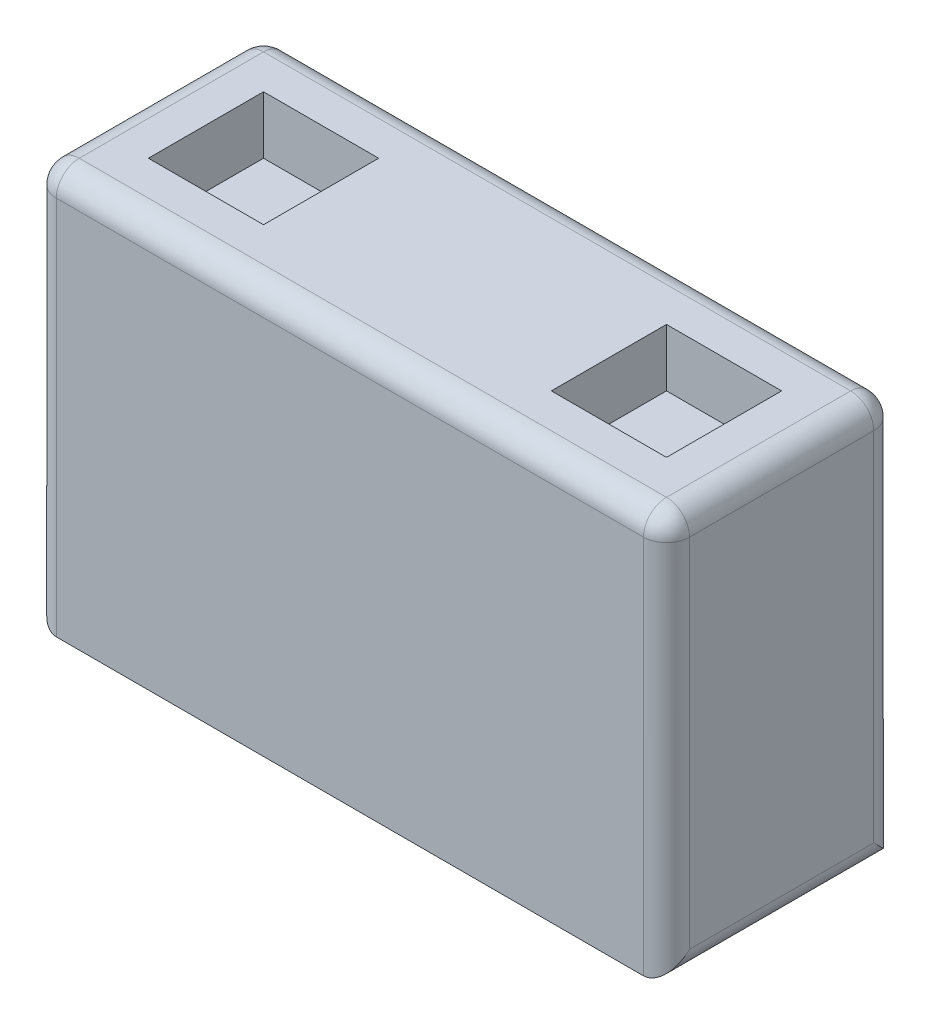
ISO-10303-21;
HEADER;
FILE_DESCRIPTION(('STEP AP214'),'2;1');
FILE_NAME('part.step','',(''),(''),'','','');
FILE_SCHEMA(('AUTOMOTIVE_DESIGN { 1 0 10303 214 1 1 1 1 }'));
ENDSEC;
DATA;
#1=APPLICATION_CONTEXT('core data for automotive mechanical design processes');
#2=APPLICATION_PROTOCOL_DEFINITION('international standard','automotive_design',2000,#1);
#3=PRODUCT_CONTEXT('',#1,'mechanical');
#4=PRODUCT('Part','Part','',(#3));
#5=PRODUCT_RELATED_PRODUCT_CATEGORY('part','',(#4));
#6=PRODUCT_DEFINITION_FORMATION('','',#4);
#7=PRODUCT_DEFINITION_CONTEXT('part definition',#1,'design');
#8=PRODUCT_DEFINITION('design','',#6,#7);
#9=PRODUCT_DEFINITION_SHAPE('','',#8);
#10=(LENGTH_UNIT() NAMED_UNIT(*) SI_UNIT(.MILLI.,.METRE.));
#11=(NAMED_UNIT(*) PLANE_ANGLE_UNIT() SI_UNIT($,.RADIAN.));
#12=(NAMED_UNIT(*) SI_UNIT($,.STERADIAN.) SOLID_ANGLE_UNIT());
#13=UNCERTAINTY_MEASURE_WITH_UNIT(LENGTH_MEASURE(1.E-05),#10,'distance_accuracy_value','');
#14=(GEOMETRIC_REPRESENTATION_CONTEXT(3) GLOBAL_UNCERTAINTY_ASSIGNED_CONTEXT((#13)) GLOBAL_UNIT_ASSIGNED_CONTEXT((#10,
#11,#12)) REPRESENTATION_CONTEXT('',''));
#15=CARTESIAN_POINT('',(0.,0.,0.));
#16=DIRECTION('',(0.,0.,1.));
#17=DIRECTION('',(1.,0.,0.));
#18=AXIS2_PLACEMENT_3D('',#15,#16,#17);
#19=CARTESIAN_POINT('',(0.,0.,20.));
#20=DIRECTION('',(0.,0.,-1.));
#21=DIRECTION('',(-1.,0.,0.));
#22=AXIS2_PLACEMENT_3D('',#19,#20,#21);
#23=PLANE('',#22);
#24=DIRECTION('',(0.,-1.,0.));
#25=VECTOR('',#24,1.);
#26=CARTESIAN_POINT('',(-25.5,0.,20.));
#27=LINE('',#26,#25);
#28=CARTESIAN_POINT('',(-25.5,30.5,20.));
#29=VERTEX_POINT('',#28);
#30=CARTESIAN_POINT('',(-25.5,-2.50000000000001,20.));
#31=VERTEX_POINT('',#30);
#32=EDGE_CURVE('E331',#29,#31,#27,.T.);
#33=ORIENTED_EDGE('',*,*,#32,.T.);
#34=DIRECTION('',(1.,0.,0.));
#35=VECTOR('',#34,1.);
#36=CARTESIAN_POINT('',(21.5,-2.5,20.));
#37=LINE('',#36,#35);
#38=CARTESIAN_POINT('',(25.5,-2.5,20.));
#39=VERTEX_POINT('',#38);
#40=EDGE_CURVE('E288',#31,#39,#37,.T.);
#41=ORIENTED_EDGE('',*,*,#40,.T.);
#42=DIRECTION('',(0.,1.,0.));
#43=VECTOR('',#42,1.);
#44=CARTESIAN_POINT('',(25.5,0.,20.));
#45=LINE('',#44,#43);
#46=CARTESIAN_POINT('',(25.5,30.5,20.));
#47=VERTEX_POINT('',#46);
#48=EDGE_CURVE('E11',#39,#47,#45,.T.);
#49=ORIENTED_EDGE('',*,*,#48,.T.);
#50=DIRECTION('',(-1.,0.,0.));
#51=VECTOR('',#50,1.);
#52=CARTESIAN_POINT('',(0.,30.5,20.));
#53=LINE('',#52,#51);
#54=EDGE_CURVE('E44',#47,#29,#53,.T.);
#55=ORIENTED_EDGE('',*,*,#54,.T.);
#56=EDGE_LOOP('',(#33,#41,#49,#55));
#57=FACE_BOUND('',#56,.T.);
#58=ADVANCED_FACE('F35',(#57),#23,.F.);
#59=CARTESIAN_POINT('',(0.,0.,0.));
#60=DIRECTION('',(0.,0.,-1.));
#61=DIRECTION('',(-1.,0.,0.));
#62=AXIS2_PLACEMENT_3D('',#59,#60,#61);
#63=PLANE('',#62);
#64=DIRECTION('',(1.,0.,0.));
#65=VECTOR('',#64,1.);
#66=CARTESIAN_POINT('',(21.5,-2.5,0.));
#67=LINE('',#66,#65);
#68=CARTESIAN_POINT('',(-25.5,-2.50000000000001,0.));
#69=VERTEX_POINT('',#68);
#70=CARTESIAN_POINT('',(25.5,-2.5,0.));
#71=VERTEX_POINT('',#70);
#72=EDGE_CURVE('E250',#69,#71,#67,.T.);
#73=ORIENTED_EDGE('',*,*,#72,.F.);
#74=DIRECTION('',(0.,-1.,0.));
#75=VECTOR('',#74,1.);
#76=CARTESIAN_POINT('',(-25.5,32.5,0.));
#77=LINE('',#76,#75);
#78=CARTESIAN_POINT('',(-25.5,30.5,0.));
#79=VERTEX_POINT('',#78);
#80=EDGE_CURVE('E315',#69,#79,#77,.F.);
#81=ORIENTED_EDGE('',*,*,#80,.T.);
#82=DIRECTION('',(-1.,0.,0.));
#83=VECTOR('',#82,1.);
#84=CARTESIAN_POINT('',(27.5,30.5,0.));
#85=LINE('',#84,#83);
#86=CARTESIAN_POINT('',(25.5,30.5,0.));
#87=VERTEX_POINT('',#86);
#88=EDGE_CURVE('E317',#79,#87,#85,.F.);
#89=ORIENTED_EDGE('',*,*,#88,.T.);
#90=DIRECTION('',(0.,1.,0.));
#91=VECTOR('',#90,1.);
#92=CARTESIAN_POINT('',(25.5,-2.5,0.));
#93=LINE('',#92,#91);
#94=EDGE_CURVE('E319',#87,#71,#93,.F.);
#95=ORIENTED_EDGE('',*,*,#94,.T.);
#96=EDGE_LOOP('',(#73,#81,#89,#95));
#97=FACE_BOUND('',#96,.T.);
#98=ADVANCED_FACE('F432',(#97),#63,.T.);
#99=CARTESIAN_POINT('',(-27.5,-2.50000000000001,20.));
#100=DIRECTION('',(1.,0.,0.));
#101=DIRECTION('',(0.,0.,-1.));
#102=AXIS2_PLACEMENT_3D('',#99,#100,#101);
#103=PLANE('',#102);
#104=DIRECTION('',(0.,0.,-1.));
#105=VECTOR('',#104,1.);
#106=CARTESIAN_POINT('',(-27.5,30.5,20.));
#107=LINE('',#106,#105);
#108=CARTESIAN_POINT('',(-27.5,30.5,18.));
#109=VERTEX_POINT('',#108);
#110=CARTESIAN_POINT('',(-27.5,30.5,2.));
#111=VERTEX_POINT('',#110);
#112=EDGE_CURVE('E296',#109,#111,#107,.T.);
#113=ORIENTED_EDGE('',*,*,#112,.T.);
#114=DIRECTION('',(0.,-1.,0.));
#115=VECTOR('',#114,1.);
#116=CARTESIAN_POINT('',(-27.5,-2.50000000000001,2.));
#117=LINE('',#116,#115);
#118=CARTESIAN_POINT('',(-27.5,-0.500000000000009,2.));
#119=VERTEX_POINT('',#118);
#120=EDGE_CURVE('E301',#111,#119,#117,.T.);
#121=ORIENTED_EDGE('',*,*,#120,.T.);
#122=DIRECTION('',(0.,0.,-1.));
#123=VECTOR('',#122,1.);
#124=CARTESIAN_POINT('',(-27.5,-0.500000000000009,20.));
#125=LINE('',#124,#123);
#126=CARTESIAN_POINT('',(-27.5,-0.500000000000009,18.));
#127=VERTEX_POINT('',#126);
#128=EDGE_CURVE('E298',#119,#127,#125,.F.);
#129=ORIENTED_EDGE('',*,*,#128,.T.);
#130=DIRECTION('',(0.,-1.,0.));
#131=VECTOR('',#130,1.);
#132=CARTESIAN_POINT('',(-27.5,-2.50000000000001,18.));
#133=LINE('',#132,#131);
#134=EDGE_CURVE('E294',#127,#109,#133,.F.);
#135=ORIENTED_EDGE('',*,*,#134,.T.);
#136=EDGE_LOOP('',(#113,#121,#129,#135));
#137=FACE_BOUND('',#136,.T.);
#138=ADVANCED_FACE('F441',(#137),#103,.F.);
#139=CARTESIAN_POINT('',(21.5,-2.5,20.));
#140=DIRECTION('',(0.,1.,0.));
#141=DIRECTION('',(0.,0.,1.));
#142=AXIS2_PLACEMENT_3D('',#139,#140,#141);
#143=PLANE('',#142);
#144=DIRECTION('',(-1.,0.,0.));
#145=VECTOR('',#144,1.);
#146=CARTESIAN_POINT('',(-21.5,-2.5,17.5));
#147=LINE('',#146,#145);
#148=CARTESIAN_POINT('',(21.5,-2.5,17.5));
#149=VERTEX_POINT('',#148);
#150=CARTESIAN_POINT('',(-21.5,-2.5,17.5));
#151=VERTEX_POINT('',#150);
#152=EDGE_CURVE('E213',#149,#151,#147,.T.);
#153=ORIENTED_EDGE('',*,*,#152,.F.);
#154=DIRECTION('',(0.,0.,1.));
#155=VECTOR('',#154,1.);
#156=CARTESIAN_POINT('',(21.5,-2.5,17.5));
#157=LINE('',#156,#155);
#158=CARTESIAN_POINT('',(21.5,-2.5,2.5));
#159=VERTEX_POINT('',#158);
#160=EDGE_CURVE('E52',#159,#149,#157,.T.);
#161=ORIENTED_EDGE('',*,*,#160,.F.);
#162=DIRECTION('',(1.,0.,0.));
#163=VECTOR('',#162,1.);
#164=CARTESIAN_POINT('',(-21.5,-2.5,2.5));
#165=LINE('',#164,#163);
#166=CARTESIAN_POINT('',(-21.5,-2.5,2.5));
#167=VERTEX_POINT('',#166);
#168=EDGE_CURVE('E204',#167,#159,#165,.T.);
#169=ORIENTED_EDGE('',*,*,#168,.F.);
#170=DIRECTION('',(0.,0.,-1.));
#171=VECTOR('',#170,1.);
#172=CARTESIAN_POINT('',(-21.5,-2.5,17.5));
#173=LINE('',#172,#171);
#174=EDGE_CURVE('E207',#151,#167,#173,.T.);
#175=ORIENTED_EDGE('',*,*,#174,.F.);
#176=EDGE_LOOP('',(#153,#161,#169,#175));
#177=FACE_BOUND('',#176,.T.);
#178=DIRECTION('',(0.,0.,-1.));
#179=VECTOR('',#178,1.);
#180=CARTESIAN_POINT('',(-25.5,-2.50000000000001,20.));
#181=LINE('',#180,#179);
#182=EDGE_CURVE('E290',#31,#69,#181,.T.);
#183=ORIENTED_EDGE('',*,*,#182,.T.);
#184=ORIENTED_EDGE('',*,*,#72,.T.);
#185=DIRECTION('',(0.,0.,-1.));
#186=VECTOR('',#185,1.);
#187=CARTESIAN_POINT('',(25.5,-2.5,20.));
#188=LINE('',#187,#186);
#189=EDGE_CURVE('E312',#71,#39,#188,.F.);
#190=ORIENTED_EDGE('',*,*,#189,.T.);
#191=ORIENTED_EDGE('',*,*,#40,.F.);
#192=EDGE_LOOP('',(#183,#184,#190,#191));
#193=FACE_BOUND('',#192,.T.);
#194=ADVANCED_FACE('F430',(#177,#193),#143,.F.);
#195=CARTESIAN_POINT('',(27.5,32.5,20.));
#196=DIRECTION('',(-1.,0.,0.));
#197=DIRECTION('',(0.,-1.,0.));
#198=AXIS2_PLACEMENT_3D('',#195,#196,#197);
#199=PLANE('',#198);
#200=DIRECTION('',(0.,1.,0.));
#201=VECTOR('',#200,1.);
#202=CARTESIAN_POINT('',(27.5,32.5,18.));
#203=LINE('',#202,#201);
#204=CARTESIAN_POINT('',(27.5,30.5,18.));
#205=VERTEX_POINT('',#204);
#206=CARTESIAN_POINT('',(27.5,-0.5,18.));
#207=VERTEX_POINT('',#206);
#208=EDGE_CURVE('E303',#205,#207,#203,.F.);
#209=ORIENTED_EDGE('',*,*,#208,.T.);
#210=DIRECTION('',(0.,0.,-1.));
#211=VECTOR('',#210,1.);
#212=CARTESIAN_POINT('',(27.5,-0.5,20.));
#213=LINE('',#212,#211);
#214=CARTESIAN_POINT('',(27.5,-0.5,2.));
#215=VERTEX_POINT('',#214);
#216=EDGE_CURVE('E309',#207,#215,#213,.T.);
#217=ORIENTED_EDGE('',*,*,#216,.T.);
#218=DIRECTION('',(0.,1.,0.));
#219=VECTOR('',#218,1.);
#220=CARTESIAN_POINT('',(27.5,32.5,2.));
#221=LINE('',#220,#219);
#222=CARTESIAN_POINT('',(27.5,30.5,2.));
#223=VERTEX_POINT('',#222);
#224=EDGE_CURVE('E307',#215,#223,#221,.T.);
#225=ORIENTED_EDGE('',*,*,#224,.T.);
#226=DIRECTION('',(0.,0.,-1.));
#227=VECTOR('',#226,1.);
#228=CARTESIAN_POINT('',(27.5,30.5,20.));
#229=LINE('',#228,#227);
#230=EDGE_CURVE('E305',#223,#205,#229,.F.);
#231=ORIENTED_EDGE('',*,*,#230,.T.);
#232=EDGE_LOOP('',(#209,#217,#225,#231));
#233=FACE_BOUND('',#232,.T.);
#234=ADVANCED_FACE('F388',(#233),#199,.F.);
#235=CARTESIAN_POINT('',(-27.5,32.5,20.));
#236=DIRECTION('',(0.,-1.,0.));
#237=DIRECTION('',(0.,0.,-1.));
#238=AXIS2_PLACEMENT_3D('',#235,#236,#237);
#239=PLANE('',#238);
#240=DIRECTION('',(-1.,0.,0.));
#241=VECTOR('',#240,1.);
#242=CARTESIAN_POINT('',(-27.5,32.5,18.));
#243=LINE('',#242,#241);
#244=CARTESIAN_POINT('',(-25.5,32.5,18.));
#245=VERTEX_POINT('',#244);
#246=CARTESIAN_POINT('',(25.5,32.5,18.));
#247=VERTEX_POINT('',#246);
#248=EDGE_CURVE('E324',#245,#247,#243,.F.);
#249=ORIENTED_EDGE('',*,*,#248,.T.);
#250=DIRECTION('',(0.,0.,-1.));
#251=VECTOR('',#250,1.);
#252=CARTESIAN_POINT('',(25.5,32.5,20.));
#253=LINE('',#252,#251);
#254=CARTESIAN_POINT('',(25.5,32.5,2.));
#255=VERTEX_POINT('',#254);
#256=EDGE_CURVE('E329',#247,#255,#253,.T.);
#257=ORIENTED_EDGE('',*,*,#256,.T.);
#258=DIRECTION('',(-1.,0.,0.));
#259=VECTOR('',#258,1.);
#260=CARTESIAN_POINT('',(-27.5,32.5,2.));
#261=LINE('',#260,#259);
#262=CARTESIAN_POINT('',(-25.5,32.5,2.));
#263=VERTEX_POINT('',#262);
#264=EDGE_CURVE('E326',#255,#263,#261,.T.);
#265=ORIENTED_EDGE('',*,*,#264,.T.);
#266=DIRECTION('',(0.,0.,-1.));
#267=VECTOR('',#266,1.);
#268=CARTESIAN_POINT('',(-25.5,32.5,20.));
#269=LINE('',#268,#267);
#270=EDGE_CURVE('E322',#263,#245,#269,.F.);
#271=ORIENTED_EDGE('',*,*,#270,.T.);
#272=EDGE_LOOP('',(#249,#257,#265,#271));
#273=FACE_BOUND('',#272,.T.);
#274=DIRECTION('',(-1.,0.,0.));
#275=VECTOR('',#274,1.);
#276=CARTESIAN_POINT('',(-22.5,32.5,5.));
#277=LINE('',#276,#275);
#278=CARTESIAN_POINT('',(-12.5,32.5,5.));
#279=VERTEX_POINT('',#278);
#280=CARTESIAN_POINT('',(-22.5,32.5,5.));
#281=VERTEX_POINT('',#280);
#282=EDGE_CURVE('E239',#279,#281,#277,.T.);
#283=ORIENTED_EDGE('',*,*,#282,.F.);
#284=DIRECTION('',(0.,0.,-1.));
#285=VECTOR('',#284,1.);
#286=CARTESIAN_POINT('',(-12.5,32.5,5.));
#287=LINE('',#286,#285);
#288=CARTESIAN_POINT('',(-12.5,32.5,15.));
#289=VERTEX_POINT('',#288);
#290=EDGE_CURVE('E237',#289,#279,#287,.T.);
#291=ORIENTED_EDGE('',*,*,#290,.F.);
#292=DIRECTION('',(1.,0.,0.));
#293=VECTOR('',#292,1.);
#294=CARTESIAN_POINT('',(-22.5,32.5,15.));
#295=LINE('',#294,#293);
#296=CARTESIAN_POINT('',(-22.5,32.5,15.));
#297=VERTEX_POINT('',#296);
#298=EDGE_CURVE('E227',#297,#289,#295,.T.);
#299=ORIENTED_EDGE('',*,*,#298,.F.);
#300=DIRECTION('',(0.,0.,1.));
#301=VECTOR('',#300,1.);
#302=CARTESIAN_POINT('',(-22.5,32.5,5.));
#303=LINE('',#302,#301);
#304=EDGE_CURVE('E243',#281,#297,#303,.T.);
#305=ORIENTED_EDGE('',*,*,#304,.F.);
#306=EDGE_LOOP('',(#283,#291,#299,#305));
#307=FACE_BOUND('',#306,.T.);
#308=DIRECTION('',(-1.,0.,0.));
#309=VECTOR('',#308,1.);
#310=CARTESIAN_POINT('',(12.5,32.5,5.));
#311=LINE('',#310,#309);
#312=CARTESIAN_POINT('',(22.5,32.5,5.));
#313=VERTEX_POINT('',#312);
#314=CARTESIAN_POINT('',(12.5,32.5,5.));
#315=VERTEX_POINT('',#314);
#316=EDGE_CURVE('E273',#313,#315,#311,.T.);
#317=ORIENTED_EDGE('',*,*,#316,.F.);
#318=DIRECTION('',(0.,0.,-1.));
#319=VECTOR('',#318,1.);
#320=CARTESIAN_POINT('',(22.5,32.5,5.));
#321=LINE('',#320,#319);
#322=CARTESIAN_POINT('',(22.5,32.5,15.));
#323=VERTEX_POINT('',#322);
#324=EDGE_CURVE('E271',#323,#313,#321,.T.);
#325=ORIENTED_EDGE('',*,*,#324,.F.);
#326=DIRECTION('',(1.,0.,0.));
#327=VECTOR('',#326,1.);
#328=CARTESIAN_POINT('',(12.5,32.5,15.));
#329=LINE('',#328,#327);
#330=CARTESIAN_POINT('',(12.5,32.5,15.));
#331=VERTEX_POINT('',#330);
#332=EDGE_CURVE('E261',#331,#323,#329,.T.);
#333=ORIENTED_EDGE('',*,*,#332,.F.);
#334=DIRECTION('',(0.,0.,1.));
#335=VECTOR('',#334,1.);
#336=CARTESIAN_POINT('',(12.5,32.5,5.));
#337=LINE('',#336,#335);
#338=EDGE_CURVE('E276',#315,#331,#337,.T.);
#339=ORIENTED_EDGE('',*,*,#338,.F.);
#340=EDGE_LOOP('',(#317,#325,#333,#339));
#341=FACE_BOUND('',#340,.T.);
#342=ADVANCED_FACE('F406',(#273,#307,#341),#239,.F.);
#343=CARTESIAN_POINT('',(22.5,27.5,5.));
#344=DIRECTION('',(1.,0.,0.));
#345=DIRECTION('',(0.,0.,-1.));
#346=AXIS2_PLACEMENT_3D('',#343,#344,#345);
#347=PLANE('',#346);
#348=ORIENTED_EDGE('',*,*,#324,.T.);
#349=DIRECTION('',(0.,1.,0.));
#350=VECTOR('',#349,1.);
#351=CARTESIAN_POINT('',(22.5,27.5,5.));
#352=LINE('',#351,#350);
#353=CARTESIAN_POINT('',(22.5,27.5,5.));
#354=VERTEX_POINT('',#353);
#355=EDGE_CURVE('E270',#354,#313,#352,.T.);
#356=ORIENTED_EDGE('',*,*,#355,.F.);
#357=DIRECTION('',(0.,0.,-1.));
#358=VECTOR('',#357,1.);
#359=CARTESIAN_POINT('',(22.5,27.5,5.));
#360=LINE('',#359,#358);
#361=CARTESIAN_POINT('',(22.5,27.5,15.));
#362=VERTEX_POINT('',#361);
#363=EDGE_CURVE('E257',#362,#354,#360,.T.);
#364=ORIENTED_EDGE('',*,*,#363,.F.);
#365=DIRECTION('',(0.,1.,0.));
#366=VECTOR('',#365,1.);
#367=CARTESIAN_POINT('',(22.5,27.5,15.));
#368=LINE('',#367,#366);
#369=EDGE_CURVE('E240',#362,#323,#368,.T.);
#370=ORIENTED_EDGE('',*,*,#369,.T.);
#371=EDGE_LOOP('',(#348,#356,#364,#370));
#372=FACE_BOUND('',#371,.T.);
#373=ADVANCED_FACE('F462',(#372),#347,.F.);
#374=CARTESIAN_POINT('',(12.5,27.5,15.));
#375=DIRECTION('',(0.,0.,1.));
#376=DIRECTION('',(1.,0.,0.));
#377=AXIS2_PLACEMENT_3D('',#374,#375,#376);
#378=PLANE('',#377);
#379=ORIENTED_EDGE('',*,*,#332,.T.);
#380=ORIENTED_EDGE('',*,*,#369,.F.);
#381=DIRECTION('',(1.,0.,0.));
#382=VECTOR('',#381,1.);
#383=CARTESIAN_POINT('',(12.5,27.5,15.));
#384=LINE('',#383,#382);
#385=CARTESIAN_POINT('',(12.5,27.5,15.));
#386=VERTEX_POINT('',#385);
#387=EDGE_CURVE('E267',#386,#362,#384,.T.);
#388=ORIENTED_EDGE('',*,*,#387,.F.);
#389=DIRECTION('',(0.,1.,0.));
#390=VECTOR('',#389,1.);
#391=CARTESIAN_POINT('',(12.5,27.5,15.));
#392=LINE('',#391,#390);
#393=EDGE_CURVE('E282',#386,#331,#392,.T.);
#394=ORIENTED_EDGE('',*,*,#393,.T.);
#395=EDGE_LOOP('',(#379,#380,#388,#394));
#396=FACE_BOUND('',#395,.T.);
#397=ADVANCED_FACE('F719',(#396),#378,.F.);
#398=CARTESIAN_POINT('',(12.5,27.5,5.));
#399=DIRECTION('',(-1.,0.,0.));
#400=DIRECTION('',(0.,0.,1.));
#401=AXIS2_PLACEMENT_3D('',#398,#399,#400);
#402=PLANE('',#401);
#403=ORIENTED_EDGE('',*,*,#338,.T.);
#404=ORIENTED_EDGE('',*,*,#393,.F.);
#405=DIRECTION('',(0.,0.,1.));
#406=VECTOR('',#405,1.);
#407=CARTESIAN_POINT('',(12.5,27.5,5.));
#408=LINE('',#407,#406);
#409=CARTESIAN_POINT('',(12.5,27.5,5.));
#410=VERTEX_POINT('',#409);
#411=EDGE_CURVE('E264',#410,#386,#408,.T.);
#412=ORIENTED_EDGE('',*,*,#411,.F.);
#413=DIRECTION('',(0.,1.,0.));
#414=VECTOR('',#413,1.);
#415=CARTESIAN_POINT('',(12.5,27.5,5.));
#416=LINE('',#415,#414);
#417=EDGE_CURVE('E284',#410,#315,#416,.T.);
#418=ORIENTED_EDGE('',*,*,#417,.T.);
#419=EDGE_LOOP('',(#403,#404,#412,#418));
#420=FACE_BOUND('',#419,.T.);
#421=ADVANCED_FACE('F712',(#420),#402,.F.);
#422=CARTESIAN_POINT('',(12.5,27.5,5.));
#423=DIRECTION('',(0.,0.,-1.));
#424=DIRECTION('',(-1.,0.,0.));
#425=AXIS2_PLACEMENT_3D('',#422,#423,#424);
#426=PLANE('',#425);
#427=ORIENTED_EDGE('',*,*,#316,.T.);
#428=ORIENTED_EDGE('',*,*,#417,.F.);
#429=DIRECTION('',(-1.,0.,0.));
#430=VECTOR('',#429,1.);
#431=CARTESIAN_POINT('',(12.5,27.5,5.));
#432=LINE('',#431,#430);
#433=EDGE_CURVE('E260',#354,#410,#432,.T.);
#434=ORIENTED_EDGE('',*,*,#433,.F.);
#435=ORIENTED_EDGE('',*,*,#355,.T.);
#436=EDGE_LOOP('',(#427,#428,#434,#435));
#437=FACE_BOUND('',#436,.T.);
#438=ADVANCED_FACE('F704',(#437),#426,.F.);
#439=CARTESIAN_POINT('',(0.,27.5,0.));
#440=DIRECTION('',(0.,1.,0.));
#441=DIRECTION('',(0.,0.,1.));
#442=AXIS2_PLACEMENT_3D('',#439,#440,#441);
#443=PLANE('',#442);
#444=ORIENTED_EDGE('',*,*,#363,.T.);
#445=ORIENTED_EDGE('',*,*,#433,.T.);
#446=ORIENTED_EDGE('',*,*,#411,.T.);
#447=ORIENTED_EDGE('',*,*,#387,.T.);
#448=EDGE_LOOP('',(#444,#445,#446,#447));
#449=FACE_BOUND('',#448,.T.);
#450=ADVANCED_FACE('F696',(#449),#443,.T.);
#451=CARTESIAN_POINT('',(-12.5,27.5,5.));
#452=DIRECTION('',(1.,0.,0.));
#453=DIRECTION('',(0.,0.,-1.));
#454=AXIS2_PLACEMENT_3D('',#451,#452,#453);
#455=PLANE('',#454);
#456=ORIENTED_EDGE('',*,*,#290,.T.);
#457=DIRECTION('',(0.,1.,0.));
#458=VECTOR('',#457,1.);
#459=CARTESIAN_POINT('',(-12.5,27.5,5.));
#460=LINE('',#459,#458);
#461=CARTESIAN_POINT('',(-12.5,27.5,5.));
#462=VERTEX_POINT('',#461);
#463=EDGE_CURVE('E236',#462,#279,#460,.T.);
#464=ORIENTED_EDGE('',*,*,#463,.F.);
#465=DIRECTION('',(0.,0.,-1.));
#466=VECTOR('',#465,1.);
#467=CARTESIAN_POINT('',(-12.5,27.5,5.));
#468=LINE('',#467,#466);
#469=CARTESIAN_POINT('',(-12.5,27.5,15.));
#470=VERTEX_POINT('',#469);
#471=EDGE_CURVE('E223',#470,#462,#468,.T.);
#472=ORIENTED_EDGE('',*,*,#471,.F.);
#473=DIRECTION('',(0.,1.,0.));
#474=VECTOR('',#473,1.);
#475=CARTESIAN_POINT('',(-12.5,27.5,15.));
#476=LINE('',#475,#474);
#477=EDGE_CURVE('E248',#470,#289,#476,.T.);
#478=ORIENTED_EDGE('',*,*,#477,.T.);
#479=EDGE_LOOP('',(#456,#464,#472,#478));
#480=FACE_BOUND('',#479,.T.);
#481=ADVANCED_FACE('F688',(#480),#455,.F.);
#482=CARTESIAN_POINT('',(-22.5,27.5,15.));
#483=DIRECTION('',(0.,0.,1.));
#484=DIRECTION('',(1.,0.,0.));
#485=AXIS2_PLACEMENT_3D('',#482,#483,#484);
#486=PLANE('',#485);
#487=ORIENTED_EDGE('',*,*,#298,.T.);
#488=ORIENTED_EDGE('',*,*,#477,.F.);
#489=DIRECTION('',(1.,0.,0.));
#490=VECTOR('',#489,1.);
#491=CARTESIAN_POINT('',(-22.5,27.5,15.));
#492=LINE('',#491,#490);
#493=CARTESIAN_POINT('',(-22.5,27.5,15.));
#494=VERTEX_POINT('',#493);
#495=EDGE_CURVE('E233',#494,#470,#492,.T.);
#496=ORIENTED_EDGE('',*,*,#495,.F.);
#497=DIRECTION('',(0.,1.,0.));
#498=VECTOR('',#497,1.);
#499=CARTESIAN_POINT('',(-22.5,27.5,15.));
#500=LINE('',#499,#498);
#501=EDGE_CURVE('E251',#494,#297,#500,.T.);
#502=ORIENTED_EDGE('',*,*,#501,.T.);
#503=EDGE_LOOP('',(#487,#488,#496,#502));
#504=FACE_BOUND('',#503,.T.);
#505=ADVANCED_FACE('F680',(#504),#486,.F.);
#506=CARTESIAN_POINT('',(-22.5,27.5,5.));
#507=DIRECTION('',(-1.,0.,0.));
#508=DIRECTION('',(0.,0.,1.));
#509=AXIS2_PLACEMENT_3D('',#506,#507,#508);
#510=PLANE('',#509);
#511=ORIENTED_EDGE('',*,*,#304,.T.);
#512=ORIENTED_EDGE('',*,*,#501,.F.);
#513=DIRECTION('',(0.,0.,1.));
#514=VECTOR('',#513,1.);
#515=CARTESIAN_POINT('',(-22.5,27.5,5.));
#516=LINE('',#515,#514);
#517=CARTESIAN_POINT('',(-22.5,27.5,5.));
#518=VERTEX_POINT('',#517);
#519=EDGE_CURVE('E230',#518,#494,#516,.T.);
#520=ORIENTED_EDGE('',*,*,#519,.F.);
#521=DIRECTION('',(0.,1.,0.));
#522=VECTOR('',#521,1.);
#523=CARTESIAN_POINT('',(-22.5,27.5,5.));
#524=LINE('',#523,#522);
#525=EDGE_CURVE('E253',#518,#281,#524,.T.);
#526=ORIENTED_EDGE('',*,*,#525,.T.);
#527=EDGE_LOOP('',(#511,#512,#520,#526));
#528=FACE_BOUND('',#527,.T.);
#529=ADVANCED_FACE('F672',(#528),#510,.F.);
#530=CARTESIAN_POINT('',(-22.5,27.5,5.));
#531=DIRECTION('',(0.,0.,-1.));
#532=DIRECTION('',(-1.,0.,0.));
#533=AXIS2_PLACEMENT_3D('',#530,#531,#532);
#534=PLANE('',#533);
#535=ORIENTED_EDGE('',*,*,#282,.T.);
#536=ORIENTED_EDGE('',*,*,#525,.F.);
#537=DIRECTION('',(-1.,0.,0.));
#538=VECTOR('',#537,1.);
#539=CARTESIAN_POINT('',(-22.5,27.5,5.));
#540=LINE('',#539,#538);
#541=EDGE_CURVE('E226',#462,#518,#540,.T.);
#542=ORIENTED_EDGE('',*,*,#541,.F.);
#543=ORIENTED_EDGE('',*,*,#463,.T.);
#544=EDGE_LOOP('',(#535,#536,#542,#543));
#545=FACE_BOUND('',#544,.T.);
#546=ADVANCED_FACE('F667',(#545),#534,.F.);
#547=CARTESIAN_POINT('',(0.,27.5,0.));
#548=DIRECTION('',(0.,1.,0.));
#549=DIRECTION('',(0.,0.,1.));
#550=AXIS2_PLACEMENT_3D('',#547,#548,#549);
#551=PLANE('',#550);
#552=ORIENTED_EDGE('',*,*,#471,.T.);
#553=ORIENTED_EDGE('',*,*,#541,.T.);
#554=ORIENTED_EDGE('',*,*,#519,.T.);
#555=ORIENTED_EDGE('',*,*,#495,.T.);
#556=EDGE_LOOP('',(#552,#553,#554,#555));
#557=FACE_BOUND('',#556,.T.);
#558=ADVANCED_FACE('F565',(#557),#551,.T.);
#559=CARTESIAN_POINT('',(25.5,-0.5,20.));
#560=DIRECTION('',(0.,0.,-1.));
#561=DIRECTION('',(-1.,0.,0.));
#562=AXIS2_PLACEMENT_3D('',#559,#560,#561);
#563=CYLINDRICAL_SURFACE('',#562,2.);
#564=CARTESIAN_POINT('',(25.5,-0.5,2.));
#565=DIRECTION('',(0.,-0.707106781186547,0.707106781186547));
#566=DIRECTION('',(0.,-0.707106781186547,-0.707106781186547));
#567=AXIS2_PLACEMENT_3D('',#564,#565,#566);
#568=ELLIPSE('',#567,2.82842712474619,2.);
#569=EDGE_CURVE('E373',#215,#71,#568,.F.);
#570=ORIENTED_EDGE('',*,*,#569,.F.);
#571=ORIENTED_EDGE('',*,*,#216,.F.);
#572=CARTESIAN_POINT('',(25.5,-0.5,18.));
#573=DIRECTION('',(0.,0.707106781186547,0.707106781186547));
#574=DIRECTION('',(0.,0.707106781186547,-0.707106781186547));
#575=AXIS2_PLACEMENT_3D('',#572,#573,#574);
#576=ELLIPSE('',#575,2.82842712474619,2.);
#577=EDGE_CURVE('E39',#39,#207,#576,.T.);
#578=ORIENTED_EDGE('',*,*,#577,.F.);
#579=ORIENTED_EDGE('',*,*,#189,.F.);
#580=EDGE_LOOP('',(#570,#571,#578,#579));
#581=FACE_BOUND('',#580,.T.);
#582=ADVANCED_FACE('F37',(#581),#563,.T.);
#583=CARTESIAN_POINT('',(25.5,0.,18.));
#584=DIRECTION('',(0.,1.,0.));
#585=DIRECTION('',(-1.,0.,0.));
#586=AXIS2_PLACEMENT_3D('',#583,#584,#585);
#587=CYLINDRICAL_SURFACE('',#586,2.);
#588=ORIENTED_EDGE('',*,*,#577,.T.);
#589=ORIENTED_EDGE('',*,*,#208,.F.);
#590=CARTESIAN_POINT('',(25.5,30.5,18.));
#591=DIRECTION('',(0.,1.,0.));
#592=DIRECTION('',(0.,0.,1.));
#593=AXIS2_PLACEMENT_3D('',#590,#591,#592);
#594=CIRCLE('',#593,2.);
#595=EDGE_CURVE('E368',#47,#205,#594,.T.);
#596=ORIENTED_EDGE('',*,*,#595,.F.);
#597=ORIENTED_EDGE('',*,*,#48,.F.);
#598=EDGE_LOOP('',(#588,#589,#596,#597));
#599=FACE_BOUND('',#598,.T.);
#600=ADVANCED_FACE('F382',(#599),#587,.T.);
#601=CARTESIAN_POINT('',(25.5,32.5,2.));
#602=DIRECTION('',(0.,-1.,0.));
#603=DIRECTION('',(1.,0.,0.));
#604=AXIS2_PLACEMENT_3D('',#601,#602,#603);
#605=CYLINDRICAL_SURFACE('',#604,2.);
#606=ORIENTED_EDGE('',*,*,#569,.T.);
#607=ORIENTED_EDGE('',*,*,#94,.F.);
#608=CARTESIAN_POINT('',(25.5,30.5,2.));
#609=DIRECTION('',(0.,1.,0.));
#610=DIRECTION('',(0.,0.,1.));
#611=AXIS2_PLACEMENT_3D('',#608,#609,#610);
#612=CIRCLE('',#611,2.);
#613=EDGE_CURVE('E365',#223,#87,#612,.T.);
#614=ORIENTED_EDGE('',*,*,#613,.F.);
#615=ORIENTED_EDGE('',*,*,#224,.F.);
#616=EDGE_LOOP('',(#606,#607,#614,#615));
#617=FACE_BOUND('',#616,.T.);
#618=ADVANCED_FACE('F396',(#617),#605,.T.);
#619=CARTESIAN_POINT('',(25.5,30.5,20.));
#620=DIRECTION('',(0.,0.,-1.));
#621=DIRECTION('',(-1.,0.,0.));
#622=AXIS2_PLACEMENT_3D('',#619,#620,#621);
#623=CYLINDRICAL_SURFACE('',#622,2.);
#624=CARTESIAN_POINT('',(25.5,30.5,18.));
#625=DIRECTION('',(0.,0.,1.));
#626=DIRECTION('',(1.,0.,0.));
#627=AXIS2_PLACEMENT_3D('',#624,#625,#626);
#628=CIRCLE('',#627,2.);
#629=EDGE_CURVE('E371',#205,#247,#628,.T.);
#630=ORIENTED_EDGE('',*,*,#629,.F.);
#631=ORIENTED_EDGE('',*,*,#230,.F.);
#632=CARTESIAN_POINT('',(25.5,30.5,2.));
#633=DIRECTION('',(0.,0.,-1.));
#634=DIRECTION('',(-1.,0.,0.));
#635=AXIS2_PLACEMENT_3D('',#632,#633,#634);
#636=CIRCLE('',#635,2.);
#637=EDGE_CURVE('E362',#255,#223,#636,.T.);
#638=ORIENTED_EDGE('',*,*,#637,.F.);
#639=ORIENTED_EDGE('',*,*,#256,.F.);
#640=EDGE_LOOP('',(#630,#631,#638,#639));
#641=FACE_BOUND('',#640,.T.);
#642=ADVANCED_FACE('F393',(#641),#623,.T.);
#643=CARTESIAN_POINT('',(25.5,30.5,18.));
#644=DIRECTION('',(0.,0.,1.));
#645=DIRECTION('',(1.,0.,0.));
#646=AXIS2_PLACEMENT_3D('',#643,#644,#645);
#647=SPHERICAL_SURFACE('',#646,2.);
#648=ORIENTED_EDGE('',*,*,#595,.T.);
#649=ORIENTED_EDGE('',*,*,#629,.T.);
#650=CARTESIAN_POINT('',(25.5,30.5,18.));
#651=DIRECTION('',(1.,0.,0.));
#652=DIRECTION('',(0.,0.,-1.));
#653=AXIS2_PLACEMENT_3D('',#650,#651,#652);
#654=CIRCLE('',#653,2.);
#655=EDGE_CURVE('E359',#47,#247,#654,.F.);
#656=ORIENTED_EDGE('',*,*,#655,.F.);
#657=EDGE_LOOP('',(#648,#649,#656));
#658=FACE_BOUND('',#657,.T.);
#659=ADVANCED_FACE('F411',(#658),#647,.T.);
#660=CARTESIAN_POINT('',(25.5,30.5,2.));
#661=DIRECTION('',(0.,0.,1.));
#662=DIRECTION('',(1.,0.,0.));
#663=AXIS2_PLACEMENT_3D('',#660,#661,#662);
#664=SPHERICAL_SURFACE('',#663,2.);
#665=ORIENTED_EDGE('',*,*,#637,.T.);
#666=ORIENTED_EDGE('',*,*,#613,.T.);
#667=CARTESIAN_POINT('',(25.5,30.5,2.));
#668=DIRECTION('',(1.,0.,0.));
#669=DIRECTION('',(0.,0.,-1.));
#670=AXIS2_PLACEMENT_3D('',#667,#668,#669);
#671=CIRCLE('',#670,2.);
#672=EDGE_CURVE('E356',#255,#87,#671,.F.);
#673=ORIENTED_EDGE('',*,*,#672,.F.);
#674=EDGE_LOOP('',(#665,#666,#673));
#675=FACE_BOUND('',#674,.T.);
#676=ADVANCED_FACE('F398',(#675),#664,.T.);
#677=CARTESIAN_POINT('',(0.,30.5,18.));
#678=DIRECTION('',(-1.,0.,0.));
#679=DIRECTION('',(0.,0.,1.));
#680=AXIS2_PLACEMENT_3D('',#677,#678,#679);
#681=CYLINDRICAL_SURFACE('',#680,2.);
#682=ORIENTED_EDGE('',*,*,#655,.T.);
#683=ORIENTED_EDGE('',*,*,#248,.F.);
#684=CARTESIAN_POINT('',(-25.5,30.5,18.));
#685=DIRECTION('',(-1.,0.,0.));
#686=DIRECTION('',(0.,0.,1.));
#687=AXIS2_PLACEMENT_3D('',#684,#685,#686);
#688=CIRCLE('',#687,2.);
#689=EDGE_CURVE('E350',#29,#245,#688,.T.);
#690=ORIENTED_EDGE('',*,*,#689,.F.);
#691=ORIENTED_EDGE('',*,*,#54,.F.);
#692=EDGE_LOOP('',(#682,#683,#690,#691));
#693=FACE_BOUND('',#692,.T.);
#694=ADVANCED_FACE('F414',(#693),#681,.T.);
#695=CARTESIAN_POINT('',(-27.5,30.5,2.));
#696=DIRECTION('',(1.,0.,0.));
#697=DIRECTION('',(0.,0.,-1.));
#698=AXIS2_PLACEMENT_3D('',#695,#696,#697);
#699=CYLINDRICAL_SURFACE('',#698,2.);
#700=ORIENTED_EDGE('',*,*,#672,.T.);
#701=ORIENTED_EDGE('',*,*,#88,.F.);
#702=CARTESIAN_POINT('',(-25.5,30.5,2.));
#703=DIRECTION('',(-1.,0.,0.));
#704=DIRECTION('',(0.,0.,1.));
#705=AXIS2_PLACEMENT_3D('',#702,#703,#704);
#706=CIRCLE('',#705,2.);
#707=EDGE_CURVE('E347',#263,#79,#706,.T.);
#708=ORIENTED_EDGE('',*,*,#707,.F.);
#709=ORIENTED_EDGE('',*,*,#264,.F.);
#710=EDGE_LOOP('',(#700,#701,#708,#709));
#711=FACE_BOUND('',#710,.T.);
#712=ADVANCED_FACE('F403',(#711),#699,.T.);
#713=CARTESIAN_POINT('',(-25.5,30.5,20.));
#714=DIRECTION('',(0.,0.,-1.));
#715=DIRECTION('',(-1.,0.,0.));
#716=AXIS2_PLACEMENT_3D('',#713,#714,#715);
#717=CYLINDRICAL_SURFACE('',#716,2.);
#718=CARTESIAN_POINT('',(-25.5,30.5,18.));
#719=DIRECTION('',(0.,0.,1.));
#720=DIRECTION('',(1.,0.,0.));
#721=AXIS2_PLACEMENT_3D('',#718,#719,#720);
#722=CIRCLE('',#721,2.);
#723=EDGE_CURVE('E353',#245,#109,#722,.T.);
#724=ORIENTED_EDGE('',*,*,#723,.F.);
#725=ORIENTED_EDGE('',*,*,#270,.F.);
#726=CARTESIAN_POINT('',(-25.5,30.5,2.));
#727=DIRECTION('',(0.,0.,-1.));
#728=DIRECTION('',(-1.,0.,0.));
#729=AXIS2_PLACEMENT_3D('',#726,#727,#728);
#730=CIRCLE('',#729,2.);
#731=EDGE_CURVE('E345',#111,#263,#730,.T.);
#732=ORIENTED_EDGE('',*,*,#731,.F.);
#733=ORIENTED_EDGE('',*,*,#112,.F.);
#734=EDGE_LOOP('',(#724,#725,#732,#733));
#735=FACE_BOUND('',#734,.T.);
#736=ADVANCED_FACE('F444',(#735),#717,.T.);
#737=CARTESIAN_POINT('',(-25.5,30.5,18.));
#738=DIRECTION('',(0.,0.,1.));
#739=DIRECTION('',(1.,0.,0.));
#740=AXIS2_PLACEMENT_3D('',#737,#738,#739);
#741=SPHERICAL_SURFACE('',#740,2.);
#742=ORIENTED_EDGE('',*,*,#689,.T.);
#743=ORIENTED_EDGE('',*,*,#723,.T.);
#744=CARTESIAN_POINT('',(-25.5,30.5,18.));
#745=DIRECTION('',(0.,1.,0.));
#746=DIRECTION('',(0.,0.,1.));
#747=AXIS2_PLACEMENT_3D('',#744,#745,#746);
#748=CIRCLE('',#747,2.);
#749=EDGE_CURVE('E342',#29,#109,#748,.F.);
#750=ORIENTED_EDGE('',*,*,#749,.F.);
#751=EDGE_LOOP('',(#742,#743,#750));
#752=FACE_BOUND('',#751,.T.);
#753=ADVANCED_FACE('F446',(#752),#741,.T.);
#754=CARTESIAN_POINT('',(-25.5,30.5,2.));
#755=DIRECTION('',(0.,0.,1.));
#756=DIRECTION('',(1.,0.,0.));
#757=AXIS2_PLACEMENT_3D('',#754,#755,#756);
#758=SPHERICAL_SURFACE('',#757,2.);
#759=ORIENTED_EDGE('',*,*,#731,.T.);
#760=ORIENTED_EDGE('',*,*,#707,.T.);
#761=CARTESIAN_POINT('',(-25.5,30.5,2.));
#762=DIRECTION('',(0.,1.,0.));
#763=DIRECTION('',(0.,0.,1.));
#764=AXIS2_PLACEMENT_3D('',#761,#762,#763);
#765=CIRCLE('',#764,2.);
#766=EDGE_CURVE('E339',#111,#79,#765,.F.);
#767=ORIENTED_EDGE('',*,*,#766,.F.);
#768=EDGE_LOOP('',(#759,#760,#767));
#769=FACE_BOUND('',#768,.T.);
#770=ADVANCED_FACE('F435',(#769),#758,.T.);
#771=CARTESIAN_POINT('',(-25.5,0.,18.));
#772=DIRECTION('',(0.,-1.,0.));
#773=DIRECTION('',(0.,0.,-1.));
#774=AXIS2_PLACEMENT_3D('',#771,#772,#773);
#775=CYLINDRICAL_SURFACE('',#774,2.);
#776=ORIENTED_EDGE('',*,*,#749,.T.);
#777=ORIENTED_EDGE('',*,*,#134,.F.);
#778=CARTESIAN_POINT('',(-25.5,-0.500000000000009,18.));
#779=DIRECTION('',(0.,-0.707106781186547,-0.707106781186547));
#780=DIRECTION('',(0.,-0.707106781186547,0.707106781186547));
#781=AXIS2_PLACEMENT_3D('',#778,#779,#780);
#782=ELLIPSE('',#781,2.82842712474619,2.);
#783=EDGE_CURVE('E337',#31,#127,#782,.T.);
#784=ORIENTED_EDGE('',*,*,#783,.F.);
#785=ORIENTED_EDGE('',*,*,#32,.F.);
#786=EDGE_LOOP('',(#776,#777,#784,#785));
#787=FACE_BOUND('',#786,.T.);
#788=ADVANCED_FACE('F423',(#787),#775,.T.);
#789=CARTESIAN_POINT('',(-25.5,-2.50000000000001,2.));
#790=DIRECTION('',(0.,1.,0.));
#791=DIRECTION('',(0.,0.,1.));
#792=AXIS2_PLACEMENT_3D('',#789,#790,#791);
#793=CYLINDRICAL_SURFACE('',#792,2.);
#794=ORIENTED_EDGE('',*,*,#766,.T.);
#795=ORIENTED_EDGE('',*,*,#80,.F.);
#796=CARTESIAN_POINT('',(-25.5,-0.500000000000009,2.));
#797=DIRECTION('',(0.,0.707106781186547,-0.707106781186547));
#798=DIRECTION('',(0.,0.707106781186547,0.707106781186547));
#799=AXIS2_PLACEMENT_3D('',#796,#797,#798);
#800=ELLIPSE('',#799,2.82842712474619,2.);
#801=EDGE_CURVE('E219',#119,#69,#800,.F.);
#802=ORIENTED_EDGE('',*,*,#801,.F.);
#803=ORIENTED_EDGE('',*,*,#120,.F.);
#804=EDGE_LOOP('',(#794,#795,#802,#803));
#805=FACE_BOUND('',#804,.T.);
#806=ADVANCED_FACE('F439',(#805),#793,.T.);
#807=CARTESIAN_POINT('',(-25.5,-0.500000000000009,20.));
#808=DIRECTION('',(0.,0.,-1.));
#809=DIRECTION('',(-1.,0.,0.));
#810=AXIS2_PLACEMENT_3D('',#807,#808,#809);
#811=CYLINDRICAL_SURFACE('',#810,2.);
#812=ORIENTED_EDGE('',*,*,#783,.T.);
#813=ORIENTED_EDGE('',*,*,#128,.F.);
#814=ORIENTED_EDGE('',*,*,#801,.T.);
#815=ORIENTED_EDGE('',*,*,#182,.F.);
#816=EDGE_LOOP('',(#812,#813,#814,#815));
#817=FACE_BOUND('',#816,.T.);
#818=ADVANCED_FACE('F426',(#817),#811,.T.);
#819=CARTESIAN_POINT('',(21.5,22.5,17.5));
#820=DIRECTION('',(1.,0.,0.));
#821=DIRECTION('',(0.,0.,-1.));
#822=AXIS2_PLACEMENT_3D('',#819,#820,#821);
#823=PLANE('',#822);
#824=ORIENTED_EDGE('',*,*,#160,.T.);
#825=DIRECTION('',(0.,-1.,0.));
#826=VECTOR('',#825,1.);
#827=CARTESIAN_POINT('',(21.5,22.5,17.5));
#828=LINE('',#827,#826);
#829=CARTESIAN_POINT('',(21.5,22.5,17.5));
#830=VERTEX_POINT('',#829);
#831=EDGE_CURVE('E182',#830,#149,#828,.T.);
#832=ORIENTED_EDGE('',*,*,#831,.F.);
#833=DIRECTION('',(0.,0.,1.));
#834=VECTOR('',#833,1.);
#835=CARTESIAN_POINT('',(21.5,22.5,17.5));
#836=LINE('',#835,#834);
#837=CARTESIAN_POINT('',(21.5,22.5,2.5));
#838=VERTEX_POINT('',#837);
#839=EDGE_CURVE('E186',#838,#830,#836,.T.);
#840=ORIENTED_EDGE('',*,*,#839,.F.);
#841=DIRECTION('',(0.,-1.,0.));
#842=VECTOR('',#841,1.);
#843=CARTESIAN_POINT('',(21.5,22.5,2.5));
#844=LINE('',#843,#842);
#845=EDGE_CURVE('E217',#838,#159,#844,.T.);
#846=ORIENTED_EDGE('',*,*,#845,.T.);
#847=EDGE_LOOP('',(#824,#832,#840,#846));
#848=FACE_BOUND('',#847,.T.);
#849=ADVANCED_FACE('F184',(#848),#823,.F.);
#850=CARTESIAN_POINT('',(-21.5,22.5,2.5));
#851=DIRECTION('',(0.,0.,-1.));
#852=DIRECTION('',(-1.,0.,0.));
#853=AXIS2_PLACEMENT_3D('',#850,#851,#852);
#854=PLANE('',#853);
#855=ORIENTED_EDGE('',*,*,#168,.T.);
#856=ORIENTED_EDGE('',*,*,#845,.F.);
#857=DIRECTION('',(1.,0.,0.));
#858=VECTOR('',#857,1.);
#859=CARTESIAN_POINT('',(-21.5,22.5,2.5));
#860=LINE('',#859,#858);
#861=CARTESIAN_POINT('',(-21.5,22.5,2.5));
#862=VERTEX_POINT('',#861);
#863=EDGE_CURVE('E192',#862,#838,#860,.T.);
#864=ORIENTED_EDGE('',*,*,#863,.F.);
#865=DIRECTION('',(0.,-1.,0.));
#866=VECTOR('',#865,1.);
#867=CARTESIAN_POINT('',(-21.5,22.5,2.5));
#868=LINE('',#867,#866);
#869=EDGE_CURVE('E220',#862,#167,#868,.T.);
#870=ORIENTED_EDGE('',*,*,#869,.T.);
#871=EDGE_LOOP('',(#855,#856,#864,#870));
#872=FACE_BOUND('',#871,.T.);
#873=ADVANCED_FACE('F497',(#872),#854,.F.);
#874=CARTESIAN_POINT('',(-21.5,22.5,17.5));
#875=DIRECTION('',(-1.,0.,0.));
#876=DIRECTION('',(0.,0.,1.));
#877=AXIS2_PLACEMENT_3D('',#874,#875,#876);
#878=PLANE('',#877);
#879=ORIENTED_EDGE('',*,*,#174,.T.);
#880=ORIENTED_EDGE('',*,*,#869,.F.);
#881=DIRECTION('',(0.,0.,-1.));
#882=VECTOR('',#881,1.);
#883=CARTESIAN_POINT('',(-21.5,22.5,17.5));
#884=LINE('',#883,#882);
#885=CARTESIAN_POINT('',(-21.5,22.5,17.5));
#886=VERTEX_POINT('',#885);
#887=EDGE_CURVE('E200',#886,#862,#884,.T.);
#888=ORIENTED_EDGE('',*,*,#887,.F.);
#889=DIRECTION('',(0.,-1.,0.));
#890=VECTOR('',#889,1.);
#891=CARTESIAN_POINT('',(-21.5,22.5,17.5));
#892=LINE('',#891,#890);
#893=EDGE_CURVE('E191',#886,#151,#892,.T.);
#894=ORIENTED_EDGE('',*,*,#893,.T.);
#895=EDGE_LOOP('',(#879,#880,#888,#894));
#896=FACE_BOUND('',#895,.T.);
#897=ADVANCED_FACE('F505',(#896),#878,.F.);
#898=CARTESIAN_POINT('',(-21.5,22.5,17.5));
#899=DIRECTION('',(0.,0.,1.));
#900=DIRECTION('',(1.,0.,0.));
#901=AXIS2_PLACEMENT_3D('',#898,#899,#900);
#902=PLANE('',#901);
#903=ORIENTED_EDGE('',*,*,#152,.T.);
#904=ORIENTED_EDGE('',*,*,#893,.F.);
#905=DIRECTION('',(-1.,0.,0.));
#906=VECTOR('',#905,1.);
#907=CARTESIAN_POINT('',(-21.5,22.5,17.5));
#908=LINE('',#907,#906);
#909=EDGE_CURVE('E195',#830,#886,#908,.T.);
#910=ORIENTED_EDGE('',*,*,#909,.F.);
#911=ORIENTED_EDGE('',*,*,#831,.T.);
#912=EDGE_LOOP('',(#903,#904,#910,#911));
#913=FACE_BOUND('',#912,.T.);
#914=ADVANCED_FACE('F196',(#913),#902,.F.);
#915=CARTESIAN_POINT('',(0.,22.5,0.));
#916=DIRECTION('',(0.,-1.,0.));
#917=DIRECTION('',(0.,0.,-1.));
#918=AXIS2_PLACEMENT_3D('',#915,#916,#917);
#919=PLANE('',#918);
#920=ORIENTED_EDGE('',*,*,#839,.T.);
#921=ORIENTED_EDGE('',*,*,#909,.T.);
#922=ORIENTED_EDGE('',*,*,#887,.T.);
#923=ORIENTED_EDGE('',*,*,#863,.T.);
#924=EDGE_LOOP('',(#920,#921,#922,#923));
#925=FACE_BOUND('',#924,.T.);
#926=ADVANCED_FACE('F202',(#925),#919,.T.);
#927=CLOSED_SHELL('',(#58,#98,#138,#194,#234,#342,#373,#397,#421,#438,#450,#481,#505,#529,#546,
#558,#582,#600,#618,#642,#659,#676,#694,#712,#736,#753,#770,#788,#806,#818,#849,#873,#897,#914,#926));
#928=MANIFOLD_SOLID_BREP('B2',#927);
#929=ADVANCED_BREP_SHAPE_REPRESENTATION('',(#18,#928),#14);
#930=SHAPE_DEFINITION_REPRESENTATION(#9,#929);
ENDSEC;
END-ISO-10303-21;
